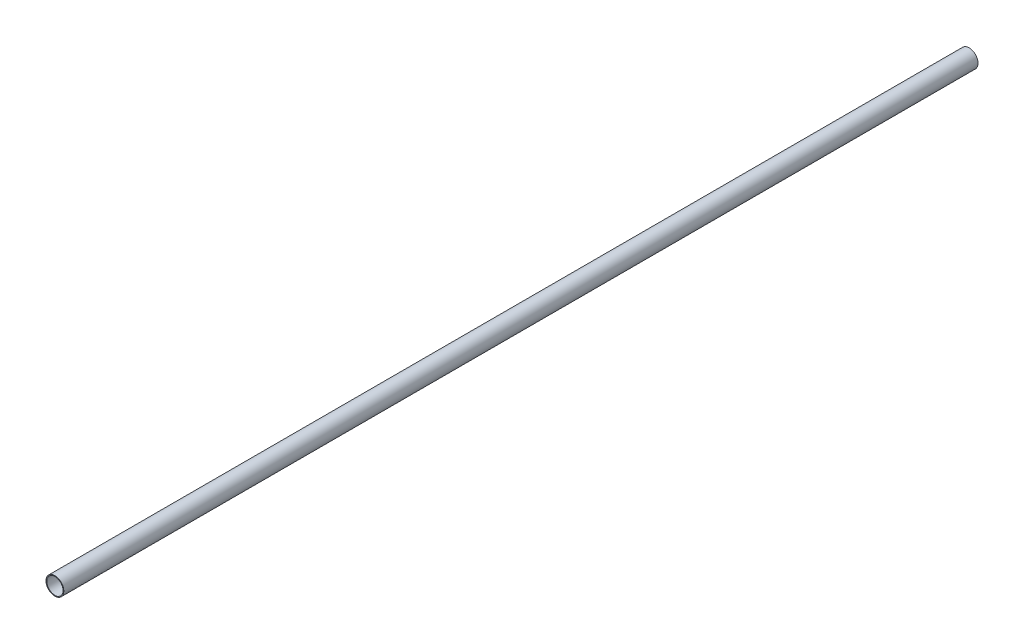
ISO-10303-21;
HEADER;
FILE_DESCRIPTION(('STEP AP214'),'2;1');
FILE_NAME('part.step','',(''),(''),'','','');
FILE_SCHEMA(('AUTOMOTIVE_DESIGN { 1 0 10303 214 1 1 1 1 }'));
ENDSEC;
DATA;
#1=APPLICATION_CONTEXT('core data for automotive mechanical design processes');
#2=APPLICATION_PROTOCOL_DEFINITION('international standard','automotive_design',2000,#1);
#3=PRODUCT_CONTEXT('',#1,'mechanical');
#4=PRODUCT('Part','Part','',(#3));
#5=PRODUCT_RELATED_PRODUCT_CATEGORY('part','',(#4));
#6=PRODUCT_DEFINITION_FORMATION('','',#4);
#7=PRODUCT_DEFINITION_CONTEXT('part definition',#1,'design');
#8=PRODUCT_DEFINITION('design','',#6,#7);
#9=PRODUCT_DEFINITION_SHAPE('','',#8);
#10=(LENGTH_UNIT() NAMED_UNIT(*) SI_UNIT(.MILLI.,.METRE.));
#11=(NAMED_UNIT(*) PLANE_ANGLE_UNIT() SI_UNIT($,.RADIAN.));
#12=(NAMED_UNIT(*) SI_UNIT($,.STERADIAN.) SOLID_ANGLE_UNIT());
#13=UNCERTAINTY_MEASURE_WITH_UNIT(LENGTH_MEASURE(1.E-05),#10,'distance_accuracy_value','');
#14=(GEOMETRIC_REPRESENTATION_CONTEXT(3) GLOBAL_UNCERTAINTY_ASSIGNED_CONTEXT((#13)) GLOBAL_UNIT_ASSIGNED_CONTEXT((#10,
#11,#12)) REPRESENTATION_CONTEXT('',''));
#15=CARTESIAN_POINT('',(0.,0.,0.));
#16=DIRECTION('',(0.,0.,1.));
#17=DIRECTION('',(1.,0.,0.));
#18=AXIS2_PLACEMENT_3D('',#15,#16,#17);
#19=CARTESIAN_POINT('',(0.,0.,8630.));
#20=DIRECTION('',(0.,0.,1.));
#21=DIRECTION('',(1.,0.,0.));
#22=AXIS2_PLACEMENT_3D('',#19,#20,#21);
#23=PLANE('',#22);
#24=CARTESIAN_POINT('',(0.,0.,8630.));
#25=DIRECTION('',(0.,0.,1.));
#26=DIRECTION('',(1.,0.,0.));
#27=AXIS2_PLACEMENT_3D('',#24,#25,#26);
#28=CIRCLE('',#27,84.1375);
#29=CARTESIAN_POINT('',(84.1375,0.,8630.));
#30=VERTEX_POINT('',#29);
#31=EDGE_CURVE('E10',#30,#30,#28,.T.);
#32=ORIENTED_EDGE('',*,*,#31,.T.);
#33=EDGE_LOOP('',(#32));
#34=FACE_BOUND('',#33,.T.);
#35=CARTESIAN_POINT('',(0.,0.,8630.));
#36=DIRECTION('',(0.,0.,1.));
#37=DIRECTION('',(1.,0.,0.));
#38=AXIS2_PLACEMENT_3D('',#35,#36,#37);
#39=CIRCLE('',#38,77.0255);
#40=CARTESIAN_POINT('',(77.0255,0.,8630.));
#41=VERTEX_POINT('',#40);
#42=EDGE_CURVE('E52',#41,#41,#39,.T.);
#43=ORIENTED_EDGE('',*,*,#42,.F.);
#44=EDGE_LOOP('',(#43));
#45=FACE_BOUND('',#44,.T.);
#46=ADVANCED_FACE('F39',(#34,#45),#23,.T.);
#47=CARTESIAN_POINT('',(0.,0.,0.));
#48=DIRECTION('',(0.,0.,1.));
#49=DIRECTION('',(1.,0.,0.));
#50=AXIS2_PLACEMENT_3D('',#47,#48,#49);
#51=PLANE('',#50);
#52=CARTESIAN_POINT('',(0.,0.,0.));
#53=DIRECTION('',(0.,0.,1.));
#54=DIRECTION('',(1.,0.,0.));
#55=AXIS2_PLACEMENT_3D('',#52,#53,#54);
#56=CIRCLE('',#55,84.1375);
#57=CARTESIAN_POINT('',(84.1375,0.,0.));
#58=VERTEX_POINT('',#57);
#59=EDGE_CURVE('E43',#58,#58,#56,.T.);
#60=ORIENTED_EDGE('',*,*,#59,.F.);
#61=EDGE_LOOP('',(#60));
#62=FACE_BOUND('',#61,.T.);
#63=CARTESIAN_POINT('',(0.,0.,0.));
#64=DIRECTION('',(0.,0.,1.));
#65=DIRECTION('',(1.,0.,0.));
#66=AXIS2_PLACEMENT_3D('',#63,#64,#65);
#67=CIRCLE('',#66,77.0255);
#68=CARTESIAN_POINT('',(77.0255,0.,0.));
#69=VERTEX_POINT('',#68);
#70=EDGE_CURVE('E54',#69,#69,#67,.T.);
#71=ORIENTED_EDGE('',*,*,#70,.T.);
#72=EDGE_LOOP('',(#71));
#73=FACE_BOUND('',#72,.T.);
#74=ADVANCED_FACE('F66',(#62,#73),#51,.F.);
#75=CARTESIAN_POINT('',(0.,0.,8630.));
#76=DIRECTION('',(0.,0.,-1.));
#77=DIRECTION('',(-1.,0.,0.));
#78=AXIS2_PLACEMENT_3D('',#75,#76,#77);
#79=CYLINDRICAL_SURFACE('',#78,84.1375);
#80=ORIENTED_EDGE('',*,*,#31,.F.);
#81=EDGE_LOOP('',(#80));
#82=FACE_BOUND('',#81,.T.);
#83=ORIENTED_EDGE('',*,*,#59,.T.);
#84=EDGE_LOOP('',(#83));
#85=FACE_BOUND('',#84,.T.);
#86=ADVANCED_FACE('F41',(#82,#85),#79,.T.);
#87=CARTESIAN_POINT('',(0.,0.,8630.));
#88=DIRECTION('',(0.,0.,-1.));
#89=DIRECTION('',(-1.,0.,0.));
#90=AXIS2_PLACEMENT_3D('',#87,#88,#89);
#91=CYLINDRICAL_SURFACE('',#90,77.0255);
#92=ORIENTED_EDGE('',*,*,#42,.T.);
#93=EDGE_LOOP('',(#92));
#94=FACE_BOUND('',#93,.T.);
#95=ORIENTED_EDGE('',*,*,#70,.F.);
#96=EDGE_LOOP('',(#95));
#97=FACE_BOUND('',#96,.T.);
#98=ADVANCED_FACE('F62',(#94,#97),#91,.F.);
#99=CLOSED_SHELL('',(#46,#74,#86,#98));
#100=MANIFOLD_SOLID_BREP('B2',#99);
#101=ADVANCED_BREP_SHAPE_REPRESENTATION('',(#18,#100),#14);
#102=SHAPE_DEFINITION_REPRESENTATION(#9,#101);
ENDSEC;
END-ISO-10303-21;
